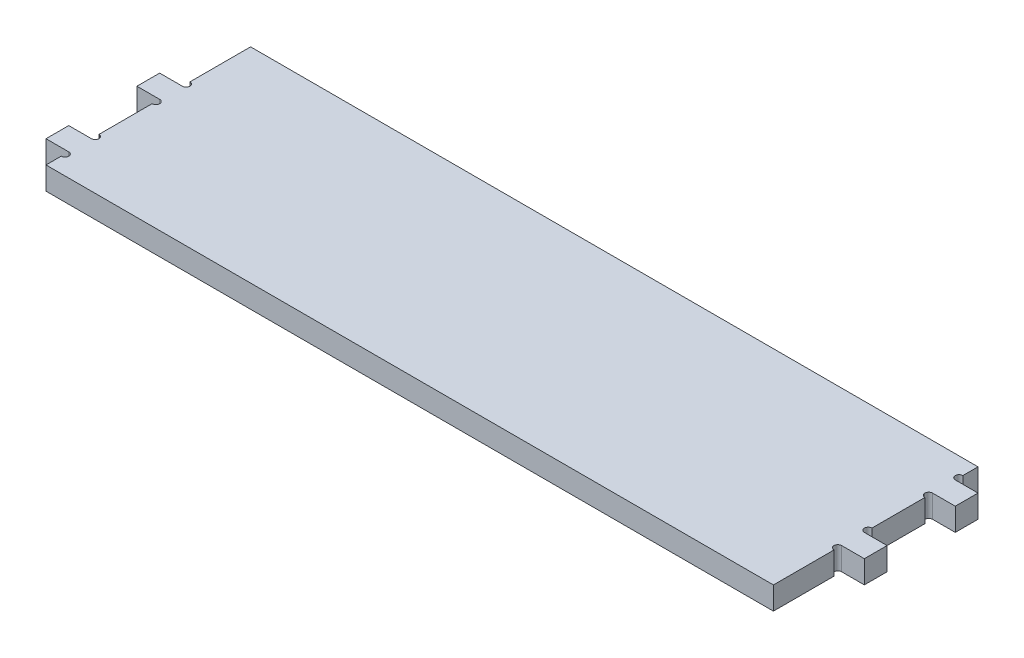
ISO-10303-21;
HEADER;
FILE_DESCRIPTION(('STEP AP214'),'2;1');
FILE_NAME('part.step','',(''),(''),'','','');
FILE_SCHEMA(('AUTOMOTIVE_DESIGN { 1 0 10303 214 1 1 1 1 }'));
ENDSEC;
DATA;
#1=APPLICATION_CONTEXT('core data for automotive mechanical design processes');
#2=APPLICATION_PROTOCOL_DEFINITION('international standard','automotive_design',2000,#1);
#3=PRODUCT_CONTEXT('',#1,'mechanical');
#4=PRODUCT('Part','Part','',(#3));
#5=PRODUCT_RELATED_PRODUCT_CATEGORY('part','',(#4));
#6=PRODUCT_DEFINITION_FORMATION('','',#4);
#7=PRODUCT_DEFINITION_CONTEXT('part definition',#1,'design');
#8=PRODUCT_DEFINITION('design','',#6,#7);
#9=PRODUCT_DEFINITION_SHAPE('','',#8);
#10=(LENGTH_UNIT() NAMED_UNIT(*) SI_UNIT(.MILLI.,.METRE.));
#11=(NAMED_UNIT(*) PLANE_ANGLE_UNIT() SI_UNIT($,.RADIAN.));
#12=(NAMED_UNIT(*) SI_UNIT($,.STERADIAN.) SOLID_ANGLE_UNIT());
#13=UNCERTAINTY_MEASURE_WITH_UNIT(LENGTH_MEASURE(1.E-05),#10,'distance_accuracy_value','');
#14=(GEOMETRIC_REPRESENTATION_CONTEXT(3) GLOBAL_UNCERTAINTY_ASSIGNED_CONTEXT((#13)) GLOBAL_UNIT_ASSIGNED_CONTEXT((#10,
#11,#12)) REPRESENTATION_CONTEXT('',''));
#15=CARTESIAN_POINT('',(0.,0.,0.));
#16=DIRECTION('',(0.,0.,1.));
#17=DIRECTION('',(1.,0.,0.));
#18=AXIS2_PLACEMENT_3D('',#15,#16,#17);
#19=CARTESIAN_POINT('',(0.,19.05,0.));
#20=DIRECTION('',(0.,1.,0.));
#21=DIRECTION('',(0.,0.,1.));
#22=AXIS2_PLACEMENT_3D('',#19,#20,#21);
#23=PLANE('',#22);
#24=DIRECTION('',(-1.,0.,0.));
#25=VECTOR('',#24,1.);
#26=CARTESIAN_POINT('',(0.,19.05,-171.45));
#27=LINE('',#26,#25);
#28=CARTESIAN_POINT('',(304.8,19.05,-171.45));
#29=VERTEX_POINT('',#28);
#30=CARTESIAN_POINT('',(-304.8,19.05,-171.45));
#31=VERTEX_POINT('',#30);
#32=EDGE_CURVE('E367',#29,#31,#27,.T.);
#33=ORIENTED_EDGE('',*,*,#32,.T.);
#34=DIRECTION('',(0.,0.,-1.));
#35=VECTOR('',#34,1.);
#36=CARTESIAN_POINT('',(-304.8,19.05,0.));
#37=LINE('',#36,#35);
#38=CARTESIAN_POINT('',(-304.8,19.05,-120.65));
#39=VERTEX_POINT('',#38);
#40=EDGE_CURVE('E369',#39,#31,#37,.T.);
#41=ORIENTED_EDGE('',*,*,#40,.F.);
#42=CARTESIAN_POINT('',(-304.8,19.05,-117.475));
#43=DIRECTION('',(0.,1.,0.));
#44=DIRECTION('',(0.,0.,1.));
#45=AXIS2_PLACEMENT_3D('',#42,#43,#44);
#46=CIRCLE('',#45,3.175);
#47=CARTESIAN_POINT('',(-304.8,19.05,-114.3));
#48=VERTEX_POINT('',#47);
#49=EDGE_CURVE('E435',#48,#39,#46,.T.);
#50=ORIENTED_EDGE('',*,*,#49,.F.);
#51=DIRECTION('',(-1.,0.,0.));
#52=VECTOR('',#51,1.);
#53=CARTESIAN_POINT('',(-304.8,19.05,-114.3));
#54=LINE('',#53,#52);
#55=CARTESIAN_POINT('',(-323.85,19.05,-114.3));
#56=VERTEX_POINT('',#55);
#57=EDGE_CURVE('E314',#48,#56,#54,.T.);
#58=ORIENTED_EDGE('',*,*,#57,.T.);
#59=DIRECTION('',(0.,0.,1.));
#60=VECTOR('',#59,1.);
#61=CARTESIAN_POINT('',(-323.85,19.05,-95.2500000000001));
#62=LINE('',#61,#60);
#63=CARTESIAN_POINT('',(-323.85,19.05,-95.2500000000001));
#64=VERTEX_POINT('',#63);
#65=EDGE_CURVE('E310',#56,#64,#62,.T.);
#66=ORIENTED_EDGE('',*,*,#65,.T.);
#67=DIRECTION('',(1.,0.,0.));
#68=VECTOR('',#67,1.);
#69=CARTESIAN_POINT('',(-304.8,19.05,-95.2500000000001));
#70=LINE('',#69,#68);
#71=CARTESIAN_POINT('',(-304.8,19.05,-95.2500000000001));
#72=VERTEX_POINT('',#71);
#73=EDGE_CURVE('E307',#64,#72,#70,.T.);
#74=ORIENTED_EDGE('',*,*,#73,.T.);
#75=CARTESIAN_POINT('',(-304.8,19.05,-92.0750000000001));
#76=DIRECTION('',(0.,1.,0.));
#77=DIRECTION('',(0.,0.,1.));
#78=AXIS2_PLACEMENT_3D('',#75,#76,#77);
#79=CIRCLE('',#78,3.175);
#80=CARTESIAN_POINT('',(-304.8,19.05,-88.9000000000001));
#81=VERTEX_POINT('',#80);
#82=EDGE_CURVE('E430',#72,#81,#79,.F.);
#83=ORIENTED_EDGE('',*,*,#82,.T.);
#84=CARTESIAN_POINT('',(-304.8,19.05,-44.4500000000001));
#85=VERTEX_POINT('',#84);
#86=EDGE_CURVE('E375',#85,#81,#37,.T.);
#87=ORIENTED_EDGE('',*,*,#86,.F.);
#88=CARTESIAN_POINT('',(-304.8,19.05,-41.2750000000001));
#89=DIRECTION('',(0.,1.,0.));
#90=DIRECTION('',(0.,0.,1.));
#91=AXIS2_PLACEMENT_3D('',#88,#89,#90);
#92=CIRCLE('',#91,3.175);
#93=CARTESIAN_POINT('',(-304.8,19.05,-38.1000000000001));
#94=VERTEX_POINT('',#93);
#95=EDGE_CURVE('E421',#94,#85,#92,.T.);
#96=ORIENTED_EDGE('',*,*,#95,.F.);
#97=DIRECTION('',(-1.,0.,0.));
#98=VECTOR('',#97,1.);
#99=CARTESIAN_POINT('',(-304.8,19.05,-38.1000000000001));
#100=LINE('',#99,#98);
#101=CARTESIAN_POINT('',(-323.85,19.05,-38.1000000000001));
#102=VERTEX_POINT('',#101);
#103=EDGE_CURVE('E317',#94,#102,#100,.T.);
#104=ORIENTED_EDGE('',*,*,#103,.T.);
#105=DIRECTION('',(0.,0.,1.));
#106=VECTOR('',#105,1.);
#107=CARTESIAN_POINT('',(-323.85,19.05,-19.0500000000001));
#108=LINE('',#107,#106);
#109=CARTESIAN_POINT('',(-323.85,19.05,-19.0500000000001));
#110=VERTEX_POINT('',#109);
#111=EDGE_CURVE('E338',#102,#110,#108,.T.);
#112=ORIENTED_EDGE('',*,*,#111,.T.);
#113=DIRECTION('',(1.,0.,0.));
#114=VECTOR('',#113,1.);
#115=CARTESIAN_POINT('',(-304.8,19.05,-19.0500000000001));
#116=LINE('',#115,#114);
#117=CARTESIAN_POINT('',(-304.8,19.05,-19.0500000000001));
#118=VERTEX_POINT('',#117);
#119=EDGE_CURVE('E329',#110,#118,#116,.T.);
#120=ORIENTED_EDGE('',*,*,#119,.T.);
#121=CARTESIAN_POINT('',(-304.8,19.05,-15.8750000000001));
#122=DIRECTION('',(0.,1.,0.));
#123=DIRECTION('',(0.,0.,1.));
#124=AXIS2_PLACEMENT_3D('',#121,#122,#123);
#125=CIRCLE('',#124,3.17500000000001);
#126=CARTESIAN_POINT('',(-304.8,19.05,-12.7000000000001));
#127=VERTEX_POINT('',#126);
#128=EDGE_CURVE('E410',#118,#127,#125,.F.);
#129=ORIENTED_EDGE('',*,*,#128,.T.);
#130=CARTESIAN_POINT('',(-304.8,19.05,0.));
#131=VERTEX_POINT('',#130);
#132=EDGE_CURVE('E371',#131,#127,#37,.T.);
#133=ORIENTED_EDGE('',*,*,#132,.F.);
#134=DIRECTION('',(-1.,0.,0.));
#135=VECTOR('',#134,1.);
#136=CARTESIAN_POINT('',(0.,19.05,0.));
#137=LINE('',#136,#135);
#138=CARTESIAN_POINT('',(304.8,19.05,0.));
#139=VERTEX_POINT('',#138);
#140=EDGE_CURVE('E374',#139,#131,#137,.T.);
#141=ORIENTED_EDGE('',*,*,#140,.F.);
#142=DIRECTION('',(0.,0.,-1.));
#143=VECTOR('',#142,1.);
#144=CARTESIAN_POINT('',(304.8,19.05,0.));
#145=LINE('',#144,#143);
#146=CARTESIAN_POINT('',(304.8,19.05,-50.8));
#147=VERTEX_POINT('',#146);
#148=EDGE_CURVE('E352',#139,#147,#145,.T.);
#149=ORIENTED_EDGE('',*,*,#148,.T.);
#150=CARTESIAN_POINT('',(304.8,19.05,-53.975));
#151=DIRECTION('',(0.,1.,0.));
#152=DIRECTION('',(0.,0.,1.));
#153=AXIS2_PLACEMENT_3D('',#150,#151,#152);
#154=CIRCLE('',#153,3.175);
#155=CARTESIAN_POINT('',(304.8,19.05,-57.15));
#156=VERTEX_POINT('',#155);
#157=EDGE_CURVE('E407',#156,#147,#154,.T.);
#158=ORIENTED_EDGE('',*,*,#157,.F.);
#159=DIRECTION('',(1.,0.,0.));
#160=VECTOR('',#159,1.);
#161=CARTESIAN_POINT('',(304.8,19.05,-57.15));
#162=LINE('',#161,#160);
#163=CARTESIAN_POINT('',(323.85,19.05,-57.15));
#164=VERTEX_POINT('',#163);
#165=EDGE_CURVE('E264',#156,#164,#162,.T.);
#166=ORIENTED_EDGE('',*,*,#165,.T.);
#167=DIRECTION('',(0.,0.,-1.));
#168=VECTOR('',#167,1.);
#169=CARTESIAN_POINT('',(323.85,19.05,-76.2));
#170=LINE('',#169,#168);
#171=CARTESIAN_POINT('',(323.85,19.05,-76.2));
#172=VERTEX_POINT('',#171);
#173=EDGE_CURVE('E450',#164,#172,#170,.T.);
#174=ORIENTED_EDGE('',*,*,#173,.T.);
#175=DIRECTION('',(-1.,0.,0.));
#176=VECTOR('',#175,1.);
#177=CARTESIAN_POINT('',(304.8,19.05,-76.2));
#178=LINE('',#177,#176);
#179=CARTESIAN_POINT('',(304.8,19.05,-76.2));
#180=VERTEX_POINT('',#179);
#181=EDGE_CURVE('E269',#172,#180,#178,.T.);
#182=ORIENTED_EDGE('',*,*,#181,.T.);
#183=CARTESIAN_POINT('',(304.8,19.05,-79.375));
#184=DIRECTION('',(0.,1.,0.));
#185=DIRECTION('',(0.,0.,1.));
#186=AXIS2_PLACEMENT_3D('',#183,#184,#185);
#187=CIRCLE('',#186,3.175);
#188=CARTESIAN_POINT('',(304.8,19.05,-82.55));
#189=VERTEX_POINT('',#188);
#190=EDGE_CURVE('E64',#180,#189,#187,.F.);
#191=ORIENTED_EDGE('',*,*,#190,.T.);
#192=CARTESIAN_POINT('',(304.8,19.05,-127.));
#193=VERTEX_POINT('',#192);
#194=EDGE_CURVE('E356',#189,#193,#145,.T.);
#195=ORIENTED_EDGE('',*,*,#194,.T.);
#196=CARTESIAN_POINT('',(304.8,19.05,-130.175));
#197=DIRECTION('',(0.,1.,0.));
#198=DIRECTION('',(0.,0.,1.));
#199=AXIS2_PLACEMENT_3D('',#196,#197,#198);
#200=CIRCLE('',#199,3.175);
#201=CARTESIAN_POINT('',(304.8,19.05,-133.35));
#202=VERTEX_POINT('',#201);
#203=EDGE_CURVE('E541',#202,#193,#200,.T.);
#204=ORIENTED_EDGE('',*,*,#203,.F.);
#205=DIRECTION('',(1.,0.,0.));
#206=VECTOR('',#205,1.);
#207=CARTESIAN_POINT('',(304.8,19.05,-133.35));
#208=LINE('',#207,#206);
#209=CARTESIAN_POINT('',(323.85,19.05,-133.35));
#210=VERTEX_POINT('',#209);
#211=EDGE_CURVE('E287',#202,#210,#208,.T.);
#212=ORIENTED_EDGE('',*,*,#211,.T.);
#213=DIRECTION('',(0.,0.,-1.));
#214=VECTOR('',#213,1.);
#215=CARTESIAN_POINT('',(323.85,19.05,-152.4));
#216=LINE('',#215,#214);
#217=CARTESIAN_POINT('',(323.85,19.05,-152.4));
#218=VERTEX_POINT('',#217);
#219=EDGE_CURVE('E283',#210,#218,#216,.T.);
#220=ORIENTED_EDGE('',*,*,#219,.T.);
#221=DIRECTION('',(-1.,0.,0.));
#222=VECTOR('',#221,1.);
#223=CARTESIAN_POINT('',(304.8,19.05,-152.4));
#224=LINE('',#223,#222);
#225=CARTESIAN_POINT('',(304.8,19.05,-152.4));
#226=VERTEX_POINT('',#225);
#227=EDGE_CURVE('E280',#218,#226,#224,.T.);
#228=ORIENTED_EDGE('',*,*,#227,.T.);
#229=CARTESIAN_POINT('',(304.8,19.05,-155.575));
#230=DIRECTION('',(0.,1.,0.));
#231=DIRECTION('',(0.,0.,1.));
#232=AXIS2_PLACEMENT_3D('',#229,#230,#231);
#233=CIRCLE('',#232,3.17500000000001);
#234=CARTESIAN_POINT('',(304.8,19.05,-158.75));
#235=VERTEX_POINT('',#234);
#236=EDGE_CURVE('E423',#226,#235,#233,.F.);
#237=ORIENTED_EDGE('',*,*,#236,.T.);
#238=EDGE_CURVE('E357',#235,#29,#145,.T.);
#239=ORIENTED_EDGE('',*,*,#238,.T.);
#240=EDGE_LOOP('',(#33,#41,#50,#58,#66,#74,#83,#87,#96,#104,#112,#120,#129,#133,#141,#149,#158,
#166,#174,#182,#191,#195,#204,#212,#220,#228,#237,#239));
#241=FACE_BOUND('',#240,.T.);
#242=ADVANCED_FACE('F49',(#241),#23,.T.);
#243=CARTESIAN_POINT('',(0.,0.,0.));
#244=DIRECTION('',(0.,1.,0.));
#245=DIRECTION('',(0.,0.,1.));
#246=AXIS2_PLACEMENT_3D('',#243,#244,#245);
#247=PLANE('',#246);
#248=DIRECTION('',(-1.,0.,0.));
#249=VECTOR('',#248,1.);
#250=CARTESIAN_POINT('',(0.,0.,0.));
#251=LINE('',#250,#249);
#252=CARTESIAN_POINT('',(304.8,0.,0.));
#253=VERTEX_POINT('',#252);
#254=CARTESIAN_POINT('',(-304.8,0.,0.));
#255=VERTEX_POINT('',#254);
#256=EDGE_CURVE('E370',#253,#255,#251,.T.);
#257=ORIENTED_EDGE('',*,*,#256,.T.);
#258=DIRECTION('',(0.,0.,-1.));
#259=VECTOR('',#258,1.);
#260=CARTESIAN_POINT('',(-304.8,0.,0.));
#261=LINE('',#260,#259);
#262=CARTESIAN_POINT('',(-304.8,0.,-12.7000000000001));
#263=VERTEX_POINT('',#262);
#264=EDGE_CURVE('E379',#255,#263,#261,.T.);
#265=ORIENTED_EDGE('',*,*,#264,.T.);
#266=CARTESIAN_POINT('',(-304.8,0.,-15.8750000000001));
#267=DIRECTION('',(0.,1.,0.));
#268=DIRECTION('',(0.,0.,1.));
#269=AXIS2_PLACEMENT_3D('',#266,#267,#268);
#270=CIRCLE('',#269,3.17500000000001);
#271=CARTESIAN_POINT('',(-304.8,0.,-19.0500000000001));
#272=VERTEX_POINT('',#271);
#273=EDGE_CURVE('E396',#272,#263,#270,.F.);
#274=ORIENTED_EDGE('',*,*,#273,.F.);
#275=DIRECTION('',(1.,0.,0.));
#276=VECTOR('',#275,1.);
#277=CARTESIAN_POINT('',(-304.8,0.,-19.0500000000001));
#278=LINE('',#277,#276);
#279=CARTESIAN_POINT('',(-323.85,0.,-19.0500000000001));
#280=VERTEX_POINT('',#279);
#281=EDGE_CURVE('E332',#280,#272,#278,.T.);
#282=ORIENTED_EDGE('',*,*,#281,.F.);
#283=DIRECTION('',(0.,0.,1.));
#284=VECTOR('',#283,1.);
#285=CARTESIAN_POINT('',(-323.85,0.,-19.0500000000001));
#286=LINE('',#285,#284);
#287=CARTESIAN_POINT('',(-323.85,0.,-38.1000000000001));
#288=VERTEX_POINT('',#287);
#289=EDGE_CURVE('E328',#288,#280,#286,.T.);
#290=ORIENTED_EDGE('',*,*,#289,.F.);
#291=DIRECTION('',(-1.,0.,0.));
#292=VECTOR('',#291,1.);
#293=CARTESIAN_POINT('',(-304.8,0.,-38.1000000000001));
#294=LINE('',#293,#292);
#295=CARTESIAN_POINT('',(-304.8,0.,-38.1000000000001));
#296=VERTEX_POINT('',#295);
#297=EDGE_CURVE('E325',#296,#288,#294,.T.);
#298=ORIENTED_EDGE('',*,*,#297,.F.);
#299=CARTESIAN_POINT('',(-304.8,0.,-41.2750000000001));
#300=DIRECTION('',(0.,1.,0.));
#301=DIRECTION('',(0.,0.,1.));
#302=AXIS2_PLACEMENT_3D('',#299,#300,#301);
#303=CIRCLE('',#302,3.175);
#304=CARTESIAN_POINT('',(-304.8,0.,-44.4500000000001));
#305=VERTEX_POINT('',#304);
#306=EDGE_CURVE('E436',#296,#305,#303,.T.);
#307=ORIENTED_EDGE('',*,*,#306,.T.);
#308=CARTESIAN_POINT('',(-304.8,0.,-88.9000000000001));
#309=VERTEX_POINT('',#308);
#310=EDGE_CURVE('E382',#305,#309,#261,.T.);
#311=ORIENTED_EDGE('',*,*,#310,.T.);
#312=CARTESIAN_POINT('',(-304.8,0.,-92.0750000000001));
#313=DIRECTION('',(0.,1.,0.));
#314=DIRECTION('',(0.,0.,1.));
#315=AXIS2_PLACEMENT_3D('',#312,#313,#314);
#316=CIRCLE('',#315,3.175);
#317=CARTESIAN_POINT('',(-304.8,0.,-95.2500000000001));
#318=VERTEX_POINT('',#317);
#319=EDGE_CURVE('E427',#318,#309,#316,.F.);
#320=ORIENTED_EDGE('',*,*,#319,.F.);
#321=DIRECTION('',(1.,0.,0.));
#322=VECTOR('',#321,1.);
#323=CARTESIAN_POINT('',(-304.8,0.,-95.2500000000001));
#324=LINE('',#323,#322);
#325=CARTESIAN_POINT('',(-323.85,0.,-95.2500000000001));
#326=VERTEX_POINT('',#325);
#327=EDGE_CURVE('E300',#326,#318,#324,.T.);
#328=ORIENTED_EDGE('',*,*,#327,.F.);
#329=DIRECTION('',(0.,0.,1.));
#330=VECTOR('',#329,1.);
#331=CARTESIAN_POINT('',(-323.85,0.,-95.2500000000001));
#332=LINE('',#331,#330);
#333=CARTESIAN_POINT('',(-323.85,0.,-114.3));
#334=VERTEX_POINT('',#333);
#335=EDGE_CURVE('E320',#334,#326,#332,.T.);
#336=ORIENTED_EDGE('',*,*,#335,.F.);
#337=DIRECTION('',(-1.,0.,0.));
#338=VECTOR('',#337,1.);
#339=CARTESIAN_POINT('',(-304.8,0.,-114.3));
#340=LINE('',#339,#338);
#341=CARTESIAN_POINT('',(-304.8,0.,-114.3));
#342=VERTEX_POINT('',#341);
#343=EDGE_CURVE('E311',#342,#334,#340,.T.);
#344=ORIENTED_EDGE('',*,*,#343,.F.);
#345=CARTESIAN_POINT('',(-304.8,0.,-117.475));
#346=DIRECTION('',(0.,1.,0.));
#347=DIRECTION('',(0.,0.,1.));
#348=AXIS2_PLACEMENT_3D('',#345,#346,#347);
#349=CIRCLE('',#348,3.175);
#350=CARTESIAN_POINT('',(-304.8,0.,-120.65));
#351=VERTEX_POINT('',#350);
#352=EDGE_CURVE('E442',#342,#351,#349,.T.);
#353=ORIENTED_EDGE('',*,*,#352,.T.);
#354=CARTESIAN_POINT('',(-304.8,0.,-171.45));
#355=VERTEX_POINT('',#354);
#356=EDGE_CURVE('E378',#351,#355,#261,.T.);
#357=ORIENTED_EDGE('',*,*,#356,.T.);
#358=DIRECTION('',(-1.,0.,0.));
#359=VECTOR('',#358,1.);
#360=CARTESIAN_POINT('',(0.,0.,-171.45));
#361=LINE('',#360,#359);
#362=CARTESIAN_POINT('',(304.8,0.,-171.45));
#363=VERTEX_POINT('',#362);
#364=EDGE_CURVE('E366',#363,#355,#361,.T.);
#365=ORIENTED_EDGE('',*,*,#364,.F.);
#366=DIRECTION('',(0.,0.,-1.));
#367=VECTOR('',#366,1.);
#368=CARTESIAN_POINT('',(304.8,0.,0.));
#369=LINE('',#368,#367);
#370=CARTESIAN_POINT('',(304.8,0.,-158.75));
#371=VERTEX_POINT('',#370);
#372=EDGE_CURVE('E346',#371,#363,#369,.T.);
#373=ORIENTED_EDGE('',*,*,#372,.F.);
#374=CARTESIAN_POINT('',(304.8,0.,-155.575));
#375=DIRECTION('',(0.,1.,0.));
#376=DIRECTION('',(0.,0.,1.));
#377=AXIS2_PLACEMENT_3D('',#374,#375,#376);
#378=CIRCLE('',#377,3.17500000000001);
#379=CARTESIAN_POINT('',(304.8,0.,-152.4));
#380=VERTEX_POINT('',#379);
#381=EDGE_CURVE('E416',#380,#371,#378,.F.);
#382=ORIENTED_EDGE('',*,*,#381,.F.);
#383=DIRECTION('',(-1.,0.,0.));
#384=VECTOR('',#383,1.);
#385=CARTESIAN_POINT('',(304.8,0.,-152.4));
#386=LINE('',#385,#384);
#387=CARTESIAN_POINT('',(323.85,0.,-152.4));
#388=VERTEX_POINT('',#387);
#389=EDGE_CURVE('E272',#388,#380,#386,.T.);
#390=ORIENTED_EDGE('',*,*,#389,.F.);
#391=DIRECTION('',(0.,0.,-1.));
#392=VECTOR('',#391,1.);
#393=CARTESIAN_POINT('',(323.85,0.,-152.4));
#394=LINE('',#393,#392);
#395=CARTESIAN_POINT('',(323.85,0.,-133.35));
#396=VERTEX_POINT('',#395);
#397=EDGE_CURVE('E293',#396,#388,#394,.T.);
#398=ORIENTED_EDGE('',*,*,#397,.F.);
#399=DIRECTION('',(1.,0.,0.));
#400=VECTOR('',#399,1.);
#401=CARTESIAN_POINT('',(304.8,0.,-133.35));
#402=LINE('',#401,#400);
#403=CARTESIAN_POINT('',(304.8,0.,-133.35));
#404=VERTEX_POINT('',#403);
#405=EDGE_CURVE('E284',#404,#396,#402,.T.);
#406=ORIENTED_EDGE('',*,*,#405,.F.);
#407=CARTESIAN_POINT('',(304.8,0.,-130.175));
#408=DIRECTION('',(0.,1.,0.));
#409=DIRECTION('',(0.,0.,1.));
#410=AXIS2_PLACEMENT_3D('',#407,#408,#409);
#411=CIRCLE('',#410,3.175);
#412=CARTESIAN_POINT('',(304.8,0.,-127.));
#413=VERTEX_POINT('',#412);
#414=EDGE_CURVE('E539',#404,#413,#411,.T.);
#415=ORIENTED_EDGE('',*,*,#414,.T.);
#416=CARTESIAN_POINT('',(304.8,0.,-82.55));
#417=VERTEX_POINT('',#416);
#418=EDGE_CURVE('E251',#417,#413,#369,.T.);
#419=ORIENTED_EDGE('',*,*,#418,.F.);
#420=CARTESIAN_POINT('',(304.8,0.,-79.375));
#421=DIRECTION('',(0.,1.,0.));
#422=DIRECTION('',(0.,0.,1.));
#423=AXIS2_PLACEMENT_3D('',#420,#421,#422);
#424=CIRCLE('',#423,3.175);
#425=CARTESIAN_POINT('',(304.8,0.,-76.2));
#426=VERTEX_POINT('',#425);
#427=EDGE_CURVE('E234',#426,#417,#424,.F.);
#428=ORIENTED_EDGE('',*,*,#427,.F.);
#429=DIRECTION('',(-1.,0.,0.));
#430=VECTOR('',#429,1.);
#431=CARTESIAN_POINT('',(304.8,0.,-76.2));
#432=LINE('',#431,#430);
#433=CARTESIAN_POINT('',(323.85,0.,-76.2));
#434=VERTEX_POINT('',#433);
#435=EDGE_CURVE('E248',#434,#426,#432,.T.);
#436=ORIENTED_EDGE('',*,*,#435,.F.);
#437=DIRECTION('',(0.,0.,-1.));
#438=VECTOR('',#437,1.);
#439=CARTESIAN_POINT('',(323.85,0.,-76.2));
#440=LINE('',#439,#438);
#441=CARTESIAN_POINT('',(323.85,0.,-57.15));
#442=VERTEX_POINT('',#441);
#443=EDGE_CURVE('E256',#442,#434,#440,.T.);
#444=ORIENTED_EDGE('',*,*,#443,.F.);
#445=DIRECTION('',(1.,0.,0.));
#446=VECTOR('',#445,1.);
#447=CARTESIAN_POINT('',(304.8,0.,-57.15));
#448=LINE('',#447,#446);
#449=CARTESIAN_POINT('',(304.8,0.,-57.15));
#450=VERTEX_POINT('',#449);
#451=EDGE_CURVE('E259',#450,#442,#448,.T.);
#452=ORIENTED_EDGE('',*,*,#451,.F.);
#453=CARTESIAN_POINT('',(304.8,0.,-53.975));
#454=DIRECTION('',(0.,1.,0.));
#455=DIRECTION('',(0.,0.,1.));
#456=AXIS2_PLACEMENT_3D('',#453,#454,#455);
#457=CIRCLE('',#456,3.175);
#458=CARTESIAN_POINT('',(304.8,0.,-50.8));
#459=VERTEX_POINT('',#458);
#460=EDGE_CURVE('E72',#450,#459,#457,.T.);
#461=ORIENTED_EDGE('',*,*,#460,.T.);
#462=EDGE_CURVE('E358',#253,#459,#369,.T.);
#463=ORIENTED_EDGE('',*,*,#462,.F.);
#464=EDGE_LOOP('',(#257,#265,#274,#282,#290,#298,#307,#311,#320,#328,#336,#344,#353,#357,#365,
#373,#382,#390,#398,#406,#415,#419,#428,#436,#444,#452,#461,#463));
#465=FACE_BOUND('',#464,.T.);
#466=ADVANCED_FACE('F246',(#465),#247,.F.);
#467=CARTESIAN_POINT('',(304.8,19.05,0.));
#468=DIRECTION('',(1.,0.,0.));
#469=DIRECTION('',(0.,0.,1.));
#470=AXIS2_PLACEMENT_3D('',#467,#468,#469);
#471=PLANE('',#470);
#472=ORIENTED_EDGE('',*,*,#194,.F.);
#473=DIRECTION('',(0.,1.,0.));
#474=VECTOR('',#473,1.);
#475=CARTESIAN_POINT('',(304.8,0.,-82.55));
#476=LINE('',#475,#474);
#477=EDGE_CURVE('E252',#417,#189,#476,.T.);
#478=ORIENTED_EDGE('',*,*,#477,.F.);
#479=ORIENTED_EDGE('',*,*,#418,.T.);
#480=DIRECTION('',(0.,1.,0.));
#481=VECTOR('',#480,1.);
#482=CARTESIAN_POINT('',(304.8,0.,-127.));
#483=LINE('',#482,#481);
#484=EDGE_CURVE('E425',#413,#193,#483,.T.);
#485=ORIENTED_EDGE('',*,*,#484,.T.);
#486=EDGE_LOOP('',(#472,#478,#479,#485));
#487=FACE_BOUND('',#486,.T.);
#488=ADVANCED_FACE('F475',(#487),#471,.T.);
#489=CARTESIAN_POINT('',(-304.8,19.05,0.));
#490=DIRECTION('',(-1.,0.,0.));
#491=DIRECTION('',(0.,0.,1.));
#492=AXIS2_PLACEMENT_3D('',#489,#490,#491);
#493=PLANE('',#492);
#494=DIRECTION('',(0.,1.,0.));
#495=VECTOR('',#494,1.);
#496=CARTESIAN_POINT('',(-304.8,0.,-44.4500000000001));
#497=LINE('',#496,#495);
#498=EDGE_CURVE('E433',#305,#85,#497,.T.);
#499=ORIENTED_EDGE('',*,*,#498,.T.);
#500=ORIENTED_EDGE('',*,*,#86,.T.);
#501=DIRECTION('',(0.,1.,0.));
#502=VECTOR('',#501,1.);
#503=CARTESIAN_POINT('',(-304.8,0.,-88.9000000000001));
#504=LINE('',#503,#502);
#505=EDGE_CURVE('E429',#309,#81,#504,.T.);
#506=ORIENTED_EDGE('',*,*,#505,.F.);
#507=ORIENTED_EDGE('',*,*,#310,.F.);
#508=EDGE_LOOP('',(#499,#500,#506,#507));
#509=FACE_BOUND('',#508,.T.);
#510=ADVANCED_FACE('F482',(#509),#493,.T.);
#511=ORIENTED_EDGE('',*,*,#132,.T.);
#512=DIRECTION('',(0.,1.,0.));
#513=VECTOR('',#512,1.);
#514=CARTESIAN_POINT('',(-304.8,0.,-12.7000000000001));
#515=LINE('',#514,#513);
#516=EDGE_CURVE('E393',#263,#127,#515,.T.);
#517=ORIENTED_EDGE('',*,*,#516,.F.);
#518=ORIENTED_EDGE('',*,*,#264,.F.);
#519=DIRECTION('',(0.,-1.,0.));
#520=VECTOR('',#519,1.);
#521=CARTESIAN_POINT('',(-304.8,19.05,0.));
#522=LINE('',#521,#520);
#523=EDGE_CURVE('E57',#131,#255,#522,.T.);
#524=ORIENTED_EDGE('',*,*,#523,.F.);
#525=EDGE_LOOP('',(#511,#517,#518,#524));
#526=FACE_BOUND('',#525,.T.);
#527=ADVANCED_FACE('F392',(#526),#493,.T.);
#528=ORIENTED_EDGE('',*,*,#238,.F.);
#529=DIRECTION('',(0.,1.,0.));
#530=VECTOR('',#529,1.);
#531=CARTESIAN_POINT('',(304.8,0.,-158.75));
#532=LINE('',#531,#530);
#533=EDGE_CURVE('E413',#371,#235,#532,.T.);
#534=ORIENTED_EDGE('',*,*,#533,.F.);
#535=ORIENTED_EDGE('',*,*,#372,.T.);
#536=DIRECTION('',(0.,-1.,0.));
#537=VECTOR('',#536,1.);
#538=CARTESIAN_POINT('',(304.8,19.05,-171.45));
#539=LINE('',#538,#537);
#540=EDGE_CURVE('E363',#29,#363,#539,.T.);
#541=ORIENTED_EDGE('',*,*,#540,.F.);
#542=EDGE_LOOP('',(#528,#534,#535,#541));
#543=FACE_BOUND('',#542,.T.);
#544=ADVANCED_FACE('F481',(#543),#471,.T.);
#545=CARTESIAN_POINT('',(0.,19.05,0.));
#546=DIRECTION('',(0.,0.,1.));
#547=DIRECTION('',(1.,0.,0.));
#548=AXIS2_PLACEMENT_3D('',#545,#546,#547);
#549=PLANE('',#548);
#550=ORIENTED_EDGE('',*,*,#523,.T.);
#551=ORIENTED_EDGE('',*,*,#256,.F.);
#552=DIRECTION('',(0.,-1.,0.));
#553=VECTOR('',#552,1.);
#554=CARTESIAN_POINT('',(304.8,19.05,0.));
#555=LINE('',#554,#553);
#556=EDGE_CURVE('E355',#139,#253,#555,.T.);
#557=ORIENTED_EDGE('',*,*,#556,.F.);
#558=ORIENTED_EDGE('',*,*,#140,.T.);
#559=EDGE_LOOP('',(#550,#551,#557,#558));
#560=FACE_BOUND('',#559,.T.);
#561=ADVANCED_FACE('F387',(#560),#549,.T.);
#562=DIRECTION('',(0.,1.,0.));
#563=VECTOR('',#562,1.);
#564=CARTESIAN_POINT('',(304.8,0.,-50.8));
#565=LINE('',#564,#563);
#566=EDGE_CURVE('E403',#459,#147,#565,.T.);
#567=ORIENTED_EDGE('',*,*,#566,.T.);
#568=ORIENTED_EDGE('',*,*,#148,.F.);
#569=ORIENTED_EDGE('',*,*,#556,.T.);
#570=ORIENTED_EDGE('',*,*,#462,.T.);
#571=EDGE_LOOP('',(#567,#568,#569,#570));
#572=FACE_BOUND('',#571,.T.);
#573=ADVANCED_FACE('F401',(#572),#471,.T.);
#574=DIRECTION('',(0.,1.,0.));
#575=VECTOR('',#574,1.);
#576=CARTESIAN_POINT('',(-304.8,0.,-120.65));
#577=LINE('',#576,#575);
#578=EDGE_CURVE('E241',#351,#39,#577,.T.);
#579=ORIENTED_EDGE('',*,*,#578,.T.);
#580=ORIENTED_EDGE('',*,*,#40,.T.);
#581=DIRECTION('',(0.,-1.,0.));
#582=VECTOR('',#581,1.);
#583=CARTESIAN_POINT('',(-304.8,19.05,-171.45));
#584=LINE('',#583,#582);
#585=EDGE_CURVE('E11',#31,#355,#584,.T.);
#586=ORIENTED_EDGE('',*,*,#585,.T.);
#587=ORIENTED_EDGE('',*,*,#356,.F.);
#588=EDGE_LOOP('',(#579,#580,#586,#587));
#589=FACE_BOUND('',#588,.T.);
#590=ADVANCED_FACE('F485',(#589),#493,.T.);
#591=CARTESIAN_POINT('',(0.,19.05,-171.45));
#592=DIRECTION('',(0.,0.,1.));
#593=DIRECTION('',(1.,0.,0.));
#594=AXIS2_PLACEMENT_3D('',#591,#592,#593);
#595=PLANE('',#594);
#596=ORIENTED_EDGE('',*,*,#585,.F.);
#597=ORIENTED_EDGE('',*,*,#32,.F.);
#598=ORIENTED_EDGE('',*,*,#540,.T.);
#599=ORIENTED_EDGE('',*,*,#364,.T.);
#600=EDGE_LOOP('',(#596,#597,#598,#599));
#601=FACE_BOUND('',#600,.T.);
#602=ADVANCED_FACE('F51',(#601),#595,.F.);
#603=CARTESIAN_POINT('',(-304.8,0.,-19.0500000000001));
#604=DIRECTION('',(0.,0.,1.));
#605=DIRECTION('',(1.,0.,0.));
#606=AXIS2_PLACEMENT_3D('',#603,#604,#605);
#607=PLANE('',#606);
#608=ORIENTED_EDGE('',*,*,#119,.F.);
#609=DIRECTION('',(0.,1.,0.));
#610=VECTOR('',#609,1.);
#611=CARTESIAN_POINT('',(-323.85,0.,-19.0500000000001));
#612=LINE('',#611,#610);
#613=EDGE_CURVE('E347',#280,#110,#612,.T.);
#614=ORIENTED_EDGE('',*,*,#613,.F.);
#615=ORIENTED_EDGE('',*,*,#281,.T.);
#616=DIRECTION('',(0.,1.,0.));
#617=VECTOR('',#616,1.);
#618=CARTESIAN_POINT('',(-304.8,0.,-19.0500000000001));
#619=LINE('',#618,#617);
#620=EDGE_CURVE('E343',#272,#118,#619,.T.);
#621=ORIENTED_EDGE('',*,*,#620,.T.);
#622=EDGE_LOOP('',(#608,#614,#615,#621));
#623=FACE_BOUND('',#622,.T.);
#624=ADVANCED_FACE('F497',(#623),#607,.T.);
#625=CARTESIAN_POINT('',(-323.85,0.,-19.0500000000001));
#626=DIRECTION('',(-1.,0.,0.));
#627=DIRECTION('',(0.,0.,1.));
#628=AXIS2_PLACEMENT_3D('',#625,#626,#627);
#629=PLANE('',#628);
#630=ORIENTED_EDGE('',*,*,#111,.F.);
#631=DIRECTION('',(0.,1.,0.));
#632=VECTOR('',#631,1.);
#633=CARTESIAN_POINT('',(-323.85,0.,-38.1000000000001));
#634=LINE('',#633,#632);
#635=EDGE_CURVE('E349',#288,#102,#634,.T.);
#636=ORIENTED_EDGE('',*,*,#635,.F.);
#637=ORIENTED_EDGE('',*,*,#289,.T.);
#638=ORIENTED_EDGE('',*,*,#613,.T.);
#639=EDGE_LOOP('',(#630,#636,#637,#638));
#640=FACE_BOUND('',#639,.T.);
#641=ADVANCED_FACE('F587',(#640),#629,.T.);
#642=CARTESIAN_POINT('',(-304.8,0.,-38.1000000000001));
#643=DIRECTION('',(0.,0.,-1.));
#644=DIRECTION('',(-1.,0.,0.));
#645=AXIS2_PLACEMENT_3D('',#642,#643,#644);
#646=PLANE('',#645);
#647=ORIENTED_EDGE('',*,*,#103,.F.);
#648=DIRECTION('',(0.,1.,0.));
#649=VECTOR('',#648,1.);
#650=CARTESIAN_POINT('',(-304.8,0.,-38.1000000000001));
#651=LINE('',#650,#649);
#652=EDGE_CURVE('E335',#296,#94,#651,.T.);
#653=ORIENTED_EDGE('',*,*,#652,.F.);
#654=ORIENTED_EDGE('',*,*,#297,.T.);
#655=ORIENTED_EDGE('',*,*,#635,.T.);
#656=EDGE_LOOP('',(#647,#653,#654,#655));
#657=FACE_BOUND('',#656,.T.);
#658=ADVANCED_FACE('F583',(#657),#646,.T.);
#659=CARTESIAN_POINT('',(-304.8,0.,-95.2500000000001));
#660=DIRECTION('',(0.,0.,1.));
#661=DIRECTION('',(1.,0.,0.));
#662=AXIS2_PLACEMENT_3D('',#659,#660,#661);
#663=PLANE('',#662);
#664=ORIENTED_EDGE('',*,*,#73,.F.);
#665=DIRECTION('',(0.,1.,0.));
#666=VECTOR('',#665,1.);
#667=CARTESIAN_POINT('',(-323.85,0.,-95.2500000000001));
#668=LINE('',#667,#666);
#669=EDGE_CURVE('E303',#326,#64,#668,.T.);
#670=ORIENTED_EDGE('',*,*,#669,.F.);
#671=ORIENTED_EDGE('',*,*,#327,.T.);
#672=DIRECTION('',(0.,1.,0.));
#673=VECTOR('',#672,1.);
#674=CARTESIAN_POINT('',(-304.8,0.,-95.2500000000001));
#675=LINE('',#674,#673);
#676=EDGE_CURVE('E290',#318,#72,#675,.T.);
#677=ORIENTED_EDGE('',*,*,#676,.T.);
#678=EDGE_LOOP('',(#664,#670,#671,#677));
#679=FACE_BOUND('',#678,.T.);
#680=ADVANCED_FACE('F520',(#679),#663,.T.);
#681=CARTESIAN_POINT('',(-323.85,0.,-95.2500000000001));
#682=DIRECTION('',(-1.,0.,0.));
#683=DIRECTION('',(0.,0.,1.));
#684=AXIS2_PLACEMENT_3D('',#681,#682,#683);
#685=PLANE('',#684);
#686=ORIENTED_EDGE('',*,*,#65,.F.);
#687=DIRECTION('',(0.,1.,0.));
#688=VECTOR('',#687,1.);
#689=CARTESIAN_POINT('',(-323.85,0.,-114.3));
#690=LINE('',#689,#688);
#691=EDGE_CURVE('E301',#334,#56,#690,.T.);
#692=ORIENTED_EDGE('',*,*,#691,.F.);
#693=ORIENTED_EDGE('',*,*,#335,.T.);
#694=ORIENTED_EDGE('',*,*,#669,.T.);
#695=EDGE_LOOP('',(#686,#692,#693,#694));
#696=FACE_BOUND('',#695,.T.);
#697=ADVANCED_FACE('F600',(#696),#685,.T.);
#698=CARTESIAN_POINT('',(-304.8,0.,-114.3));
#699=DIRECTION('',(0.,0.,-1.));
#700=DIRECTION('',(-1.,0.,0.));
#701=AXIS2_PLACEMENT_3D('',#698,#699,#700);
#702=PLANE('',#701);
#703=ORIENTED_EDGE('',*,*,#57,.F.);
#704=DIRECTION('',(0.,1.,0.));
#705=VECTOR('',#704,1.);
#706=CARTESIAN_POINT('',(-304.8,0.,-114.3));
#707=LINE('',#706,#705);
#708=EDGE_CURVE('E298',#342,#48,#707,.T.);
#709=ORIENTED_EDGE('',*,*,#708,.F.);
#710=ORIENTED_EDGE('',*,*,#343,.T.);
#711=ORIENTED_EDGE('',*,*,#691,.T.);
#712=EDGE_LOOP('',(#703,#709,#710,#711));
#713=FACE_BOUND('',#712,.T.);
#714=ADVANCED_FACE('F605',(#713),#702,.T.);
#715=CARTESIAN_POINT('',(304.8,0.,-152.4));
#716=DIRECTION('',(0.,0.,-1.));
#717=DIRECTION('',(-1.,0.,0.));
#718=AXIS2_PLACEMENT_3D('',#715,#716,#717);
#719=PLANE('',#718);
#720=ORIENTED_EDGE('',*,*,#227,.F.);
#721=DIRECTION('',(0.,1.,0.));
#722=VECTOR('',#721,1.);
#723=CARTESIAN_POINT('',(323.85,0.,-152.4));
#724=LINE('',#723,#722);
#725=EDGE_CURVE('E275',#388,#218,#724,.T.);
#726=ORIENTED_EDGE('',*,*,#725,.F.);
#727=ORIENTED_EDGE('',*,*,#389,.T.);
#728=DIRECTION('',(0.,1.,0.));
#729=VECTOR('',#728,1.);
#730=CARTESIAN_POINT('',(304.8,0.,-152.4));
#731=LINE('',#730,#729);
#732=EDGE_CURVE('E277',#380,#226,#731,.T.);
#733=ORIENTED_EDGE('',*,*,#732,.T.);
#734=EDGE_LOOP('',(#720,#726,#727,#733));
#735=FACE_BOUND('',#734,.T.);
#736=ADVANCED_FACE('F557',(#735),#719,.T.);
#737=CARTESIAN_POINT('',(323.85,0.,-152.4));
#738=DIRECTION('',(1.,0.,0.));
#739=DIRECTION('',(0.,0.,-1.));
#740=AXIS2_PLACEMENT_3D('',#737,#738,#739);
#741=PLANE('',#740);
#742=ORIENTED_EDGE('',*,*,#219,.F.);
#743=DIRECTION('',(0.,1.,0.));
#744=VECTOR('',#743,1.);
#745=CARTESIAN_POINT('',(323.85,0.,-133.35));
#746=LINE('',#745,#744);
#747=EDGE_CURVE('E273',#396,#210,#746,.T.);
#748=ORIENTED_EDGE('',*,*,#747,.F.);
#749=ORIENTED_EDGE('',*,*,#397,.T.);
#750=ORIENTED_EDGE('',*,*,#725,.T.);
#751=EDGE_LOOP('',(#742,#748,#749,#750));
#752=FACE_BOUND('',#751,.T.);
#753=ADVANCED_FACE('F554',(#752),#741,.T.);
#754=CARTESIAN_POINT('',(304.8,0.,-133.35));
#755=DIRECTION('',(0.,0.,1.));
#756=DIRECTION('',(1.,0.,0.));
#757=AXIS2_PLACEMENT_3D('',#754,#755,#756);
#758=PLANE('',#757);
#759=ORIENTED_EDGE('',*,*,#211,.F.);
#760=DIRECTION('',(0.,1.,0.));
#761=VECTOR('',#760,1.);
#762=CARTESIAN_POINT('',(304.8,0.,-133.35));
#763=LINE('',#762,#761);
#764=EDGE_CURVE('E270',#404,#202,#763,.T.);
#765=ORIENTED_EDGE('',*,*,#764,.F.);
#766=ORIENTED_EDGE('',*,*,#405,.T.);
#767=ORIENTED_EDGE('',*,*,#747,.T.);
#768=EDGE_LOOP('',(#759,#765,#766,#767));
#769=FACE_BOUND('',#768,.T.);
#770=ADVANCED_FACE('F467',(#769),#758,.T.);
#771=CARTESIAN_POINT('',(304.8,0.,-76.2));
#772=DIRECTION('',(0.,0.,-1.));
#773=DIRECTION('',(-1.,0.,0.));
#774=AXIS2_PLACEMENT_3D('',#771,#772,#773);
#775=PLANE('',#774);
#776=ORIENTED_EDGE('',*,*,#181,.F.);
#777=DIRECTION('',(0.,1.,0.));
#778=VECTOR('',#777,1.);
#779=CARTESIAN_POINT('',(323.85,0.,-76.2));
#780=LINE('',#779,#778);
#781=EDGE_CURVE('E240',#434,#172,#780,.T.);
#782=ORIENTED_EDGE('',*,*,#781,.F.);
#783=ORIENTED_EDGE('',*,*,#435,.T.);
#784=DIRECTION('',(0.,1.,0.));
#785=VECTOR('',#784,1.);
#786=CARTESIAN_POINT('',(304.8,0.,-76.2));
#787=LINE('',#786,#785);
#788=EDGE_CURVE('E231',#426,#180,#787,.T.);
#789=ORIENTED_EDGE('',*,*,#788,.T.);
#790=EDGE_LOOP('',(#776,#782,#783,#789));
#791=FACE_BOUND('',#790,.T.);
#792=ADVANCED_FACE('F254',(#791),#775,.T.);
#793=CARTESIAN_POINT('',(323.85,0.,-76.2));
#794=DIRECTION('',(1.,0.,0.));
#795=DIRECTION('',(0.,0.,-1.));
#796=AXIS2_PLACEMENT_3D('',#793,#794,#795);
#797=PLANE('',#796);
#798=ORIENTED_EDGE('',*,*,#173,.F.);
#799=DIRECTION('',(0.,1.,0.));
#800=VECTOR('',#799,1.);
#801=CARTESIAN_POINT('',(323.85,0.,-57.15));
#802=LINE('',#801,#800);
#803=EDGE_CURVE('E261',#442,#164,#802,.T.);
#804=ORIENTED_EDGE('',*,*,#803,.F.);
#805=ORIENTED_EDGE('',*,*,#443,.T.);
#806=ORIENTED_EDGE('',*,*,#781,.T.);
#807=EDGE_LOOP('',(#798,#804,#805,#806));
#808=FACE_BOUND('',#807,.T.);
#809=ADVANCED_FACE('F456',(#808),#797,.T.);
#810=CARTESIAN_POINT('',(304.8,0.,-57.15));
#811=DIRECTION('',(0.,0.,1.));
#812=DIRECTION('',(1.,0.,0.));
#813=AXIS2_PLACEMENT_3D('',#810,#811,#812);
#814=PLANE('',#813);
#815=ORIENTED_EDGE('',*,*,#165,.F.);
#816=DIRECTION('',(0.,1.,0.));
#817=VECTOR('',#816,1.);
#818=CARTESIAN_POINT('',(304.8,0.,-57.15));
#819=LINE('',#818,#817);
#820=EDGE_CURVE('E257',#450,#156,#819,.T.);
#821=ORIENTED_EDGE('',*,*,#820,.F.);
#822=ORIENTED_EDGE('',*,*,#451,.T.);
#823=ORIENTED_EDGE('',*,*,#803,.T.);
#824=EDGE_LOOP('',(#815,#821,#822,#823));
#825=FACE_BOUND('',#824,.T.);
#826=ADVANCED_FACE('F454',(#825),#814,.T.);
#827=CARTESIAN_POINT('',(304.8,0.,-53.975));
#828=DIRECTION('',(0.,1.,0.));
#829=DIRECTION('',(0.,0.,1.));
#830=AXIS2_PLACEMENT_3D('',#827,#828,#829);
#831=CYLINDRICAL_SURFACE('',#830,3.175);
#832=ORIENTED_EDGE('',*,*,#157,.T.);
#833=ORIENTED_EDGE('',*,*,#566,.F.);
#834=ORIENTED_EDGE('',*,*,#460,.F.);
#835=ORIENTED_EDGE('',*,*,#820,.T.);
#836=EDGE_LOOP('',(#832,#833,#834,#835));
#837=FACE_BOUND('',#836,.T.);
#838=ADVANCED_FACE('F464',(#837),#831,.F.);
#839=CARTESIAN_POINT('',(304.8,0.,-79.375));
#840=DIRECTION('',(0.,1.,0.));
#841=DIRECTION('',(0.,0.,1.));
#842=AXIS2_PLACEMENT_3D('',#839,#840,#841);
#843=CYLINDRICAL_SURFACE('',#842,3.175);
#844=ORIENTED_EDGE('',*,*,#190,.F.);
#845=ORIENTED_EDGE('',*,*,#788,.F.);
#846=ORIENTED_EDGE('',*,*,#427,.T.);
#847=ORIENTED_EDGE('',*,*,#477,.T.);
#848=EDGE_LOOP('',(#844,#845,#846,#847));
#849=FACE_BOUND('',#848,.T.);
#850=ADVANCED_FACE('F233',(#849),#843,.F.);
#851=CARTESIAN_POINT('',(304.8,0.,-130.175));
#852=DIRECTION('',(0.,1.,0.));
#853=DIRECTION('',(0.,0.,1.));
#854=AXIS2_PLACEMENT_3D('',#851,#852,#853);
#855=CYLINDRICAL_SURFACE('',#854,3.175);
#856=ORIENTED_EDGE('',*,*,#203,.T.);
#857=ORIENTED_EDGE('',*,*,#484,.F.);
#858=ORIENTED_EDGE('',*,*,#414,.F.);
#859=ORIENTED_EDGE('',*,*,#764,.T.);
#860=EDGE_LOOP('',(#856,#857,#858,#859));
#861=FACE_BOUND('',#860,.T.);
#862=ADVANCED_FACE('F546',(#861),#855,.F.);
#863=CARTESIAN_POINT('',(304.8,0.,-155.575));
#864=DIRECTION('',(0.,1.,0.));
#865=DIRECTION('',(0.,0.,1.));
#866=AXIS2_PLACEMENT_3D('',#863,#864,#865);
#867=CYLINDRICAL_SURFACE('',#866,3.17500000000001);
#868=ORIENTED_EDGE('',*,*,#236,.F.);
#869=ORIENTED_EDGE('',*,*,#732,.F.);
#870=ORIENTED_EDGE('',*,*,#381,.T.);
#871=ORIENTED_EDGE('',*,*,#533,.T.);
#872=EDGE_LOOP('',(#868,#869,#870,#871));
#873=FACE_BOUND('',#872,.T.);
#874=ADVANCED_FACE('F560',(#873),#867,.F.);
#875=CARTESIAN_POINT('',(-304.8,0.,-117.475));
#876=DIRECTION('',(0.,1.,0.));
#877=DIRECTION('',(0.,0.,1.));
#878=AXIS2_PLACEMENT_3D('',#875,#876,#877);
#879=CYLINDRICAL_SURFACE('',#878,3.175);
#880=ORIENTED_EDGE('',*,*,#49,.T.);
#881=ORIENTED_EDGE('',*,*,#578,.F.);
#882=ORIENTED_EDGE('',*,*,#352,.F.);
#883=ORIENTED_EDGE('',*,*,#708,.T.);
#884=EDGE_LOOP('',(#880,#881,#882,#883));
#885=FACE_BOUND('',#884,.T.);
#886=ADVANCED_FACE('F562',(#885),#879,.F.);
#887=CARTESIAN_POINT('',(-304.8,0.,-92.0750000000001));
#888=DIRECTION('',(0.,1.,0.));
#889=DIRECTION('',(0.,0.,1.));
#890=AXIS2_PLACEMENT_3D('',#887,#888,#889);
#891=CYLINDRICAL_SURFACE('',#890,3.175);
#892=ORIENTED_EDGE('',*,*,#82,.F.);
#893=ORIENTED_EDGE('',*,*,#676,.F.);
#894=ORIENTED_EDGE('',*,*,#319,.T.);
#895=ORIENTED_EDGE('',*,*,#505,.T.);
#896=EDGE_LOOP('',(#892,#893,#894,#895));
#897=FACE_BOUND('',#896,.T.);
#898=ADVANCED_FACE('F517',(#897),#891,.F.);
#899=CARTESIAN_POINT('',(-304.8,0.,-41.2750000000001));
#900=DIRECTION('',(0.,1.,0.));
#901=DIRECTION('',(0.,0.,1.));
#902=AXIS2_PLACEMENT_3D('',#899,#900,#901);
#903=CYLINDRICAL_SURFACE('',#902,3.175);
#904=ORIENTED_EDGE('',*,*,#95,.T.);
#905=ORIENTED_EDGE('',*,*,#498,.F.);
#906=ORIENTED_EDGE('',*,*,#306,.F.);
#907=ORIENTED_EDGE('',*,*,#652,.T.);
#908=EDGE_LOOP('',(#904,#905,#906,#907));
#909=FACE_BOUND('',#908,.T.);
#910=ADVANCED_FACE('F576',(#909),#903,.F.);
#911=CARTESIAN_POINT('',(-304.8,0.,-15.8750000000001));
#912=DIRECTION('',(0.,1.,0.));
#913=DIRECTION('',(0.,0.,1.));
#914=AXIS2_PLACEMENT_3D('',#911,#912,#913);
#915=CYLINDRICAL_SURFACE('',#914,3.17500000000001);
#916=ORIENTED_EDGE('',*,*,#128,.F.);
#917=ORIENTED_EDGE('',*,*,#620,.F.);
#918=ORIENTED_EDGE('',*,*,#273,.T.);
#919=ORIENTED_EDGE('',*,*,#516,.T.);
#920=EDGE_LOOP('',(#916,#917,#918,#919));
#921=FACE_BOUND('',#920,.T.);
#922=ADVANCED_FACE('F572',(#921),#915,.F.);
#923=CLOSED_SHELL('',(#242,#466,#488,#510,#527,#544,#561,#573,#590,#602,#624,#641,#658,#680,
#697,#714,#736,#753,#770,#792,#809,#826,#838,#850,#862,#874,#886,#898,#910,#922));
#924=MANIFOLD_SOLID_BREP('B2',#923);
#925=ADVANCED_BREP_SHAPE_REPRESENTATION('',(#18,#924),#14);
#926=SHAPE_DEFINITION_REPRESENTATION(#9,#925);
ENDSEC;
END-ISO-10303-21;
